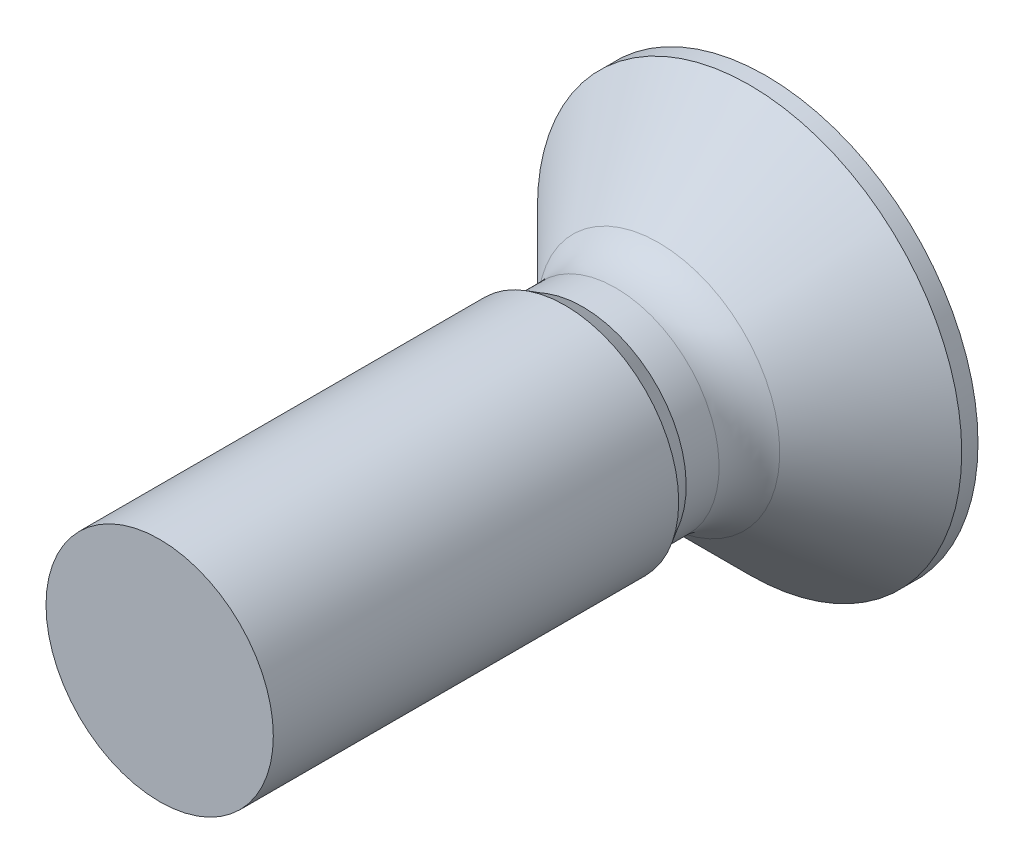
ISO-10303-21;
HEADER;
FILE_DESCRIPTION(('STEP AP214'),'2;1');
FILE_NAME('part.step','',(''),(''),'','','');
FILE_SCHEMA(('AUTOMOTIVE_DESIGN { 1 0 10303 214 1 1 1 1 }'));
ENDSEC;
DATA;
#1=APPLICATION_CONTEXT('core data for automotive mechanical design processes');
#2=APPLICATION_PROTOCOL_DEFINITION('international standard','automotive_design',2000,#1);
#3=PRODUCT_CONTEXT('',#1,'mechanical');
#4=PRODUCT('Part','Part','',(#3));
#5=PRODUCT_RELATED_PRODUCT_CATEGORY('part','',(#4));
#6=PRODUCT_DEFINITION_FORMATION('','',#4);
#7=PRODUCT_DEFINITION_CONTEXT('part definition',#1,'design');
#8=PRODUCT_DEFINITION('design','',#6,#7);
#9=PRODUCT_DEFINITION_SHAPE('','',#8);
#10=(LENGTH_UNIT() NAMED_UNIT(*) SI_UNIT(.MILLI.,.METRE.));
#11=(NAMED_UNIT(*) PLANE_ANGLE_UNIT() SI_UNIT($,.RADIAN.));
#12=(NAMED_UNIT(*) SI_UNIT($,.STERADIAN.) SOLID_ANGLE_UNIT());
#13=UNCERTAINTY_MEASURE_WITH_UNIT(LENGTH_MEASURE(1.E-05),#10,'distance_accuracy_value','');
#14=(GEOMETRIC_REPRESENTATION_CONTEXT(3) GLOBAL_UNCERTAINTY_ASSIGNED_CONTEXT((#13)) GLOBAL_UNIT_ASSIGNED_CONTEXT((#10,
#11,#12)) REPRESENTATION_CONTEXT('',''));
#15=CARTESIAN_POINT('',(0.,0.,0.));
#16=DIRECTION('',(0.,0.,1.));
#17=DIRECTION('',(1.,0.,0.));
#18=AXIS2_PLACEMENT_3D('',#15,#16,#17);
#19=CARTESIAN_POINT('',(0.,0.,-1.65));
#20=DIRECTION('',(0.,0.,-1.));
#21=DIRECTION('',(0.,1.,0.));
#22=AXIS2_PLACEMENT_3D('',#19,#20,#21);
#23=CONICAL_SURFACE('',#22,3.01468750000001,0.78539816339745);
#24=CARTESIAN_POINT('',(0.,0.,-0.234314575050763));
#25=DIRECTION('',(0.,0.,-1.));
#26=DIRECTION('',(0.,1.,0.));
#27=AXIS2_PLACEMENT_3D('',#24,#25,#26);
#28=CIRCLE('',#27,1.59900207505076);
#29=CARTESIAN_POINT('',(0.,1.59900207505076,-0.234314575050763));
#30=VERTEX_POINT('',#29);
#31=EDGE_CURVE('E40',#30,#30,#28,.T.);
#32=ORIENTED_EDGE('',*,*,#31,.T.);
#33=EDGE_LOOP('',(#32));
#34=FACE_BOUND('',#33,.T.);
#35=CARTESIAN_POINT('',(0.,0.,-1.4353125));
#36=DIRECTION('',(0.,0.,-1.));
#37=DIRECTION('',(0.,1.,0.));
#38=AXIS2_PLACEMENT_3D('',#35,#36,#37);
#39=CIRCLE('',#38,2.8);
#40=CARTESIAN_POINT('',(0.,2.8,-1.43531249999999));
#41=VERTEX_POINT('',#40);
#42=EDGE_CURVE('E227',#41,#41,#39,.F.);
#43=ORIENTED_EDGE('',*,*,#42,.T.);
#44=EDGE_LOOP('',(#43));
#45=FACE_BOUND('',#44,.T.);
#46=ADVANCED_FACE('F32',(#34,#45),#23,.T.);
#47=CARTESIAN_POINT('',(0.,0.,-1.65));
#48=DIRECTION('',(0.,0.,-1.));
#49=DIRECTION('',(0.,1.,0.));
#50=AXIS2_PLACEMENT_3D('',#47,#48,#49);
#51=CYLINDRICAL_SURFACE('',#50,1.3646875);
#52=CARTESIAN_POINT('',(0.,0.,0.331370849898476));
#53=DIRECTION('',(0.,0.,-1.));
#54=DIRECTION('',(0.,1.,0.));
#55=AXIS2_PLACEMENT_3D('',#52,#53,#54);
#56=CIRCLE('',#55,1.3646875);
#57=CARTESIAN_POINT('',(0.,1.3646875,0.331370849898476));
#58=VERTEX_POINT('',#57);
#59=EDGE_CURVE('E11',#58,#58,#56,.F.);
#60=ORIENTED_EDGE('',*,*,#59,.T.);
#61=EDGE_LOOP('',(#60));
#62=FACE_BOUND('',#61,.T.);
#63=CARTESIAN_POINT('',(0.,0.,0.765631875100837));
#64=DIRECTION('',(0.,0.,-1.));
#65=DIRECTION('',(0.,1.,0.));
#66=AXIS2_PLACEMENT_3D('',#63,#64,#65);
#67=CIRCLE('',#66,1.3646875);
#68=CARTESIAN_POINT('',(0.,1.3646875,0.765631875100837));
#69=VERTEX_POINT('',#68);
#70=EDGE_CURVE('E234',#69,#69,#67,.T.);
#71=ORIENTED_EDGE('',*,*,#70,.T.);
#72=EDGE_LOOP('',(#71));
#73=FACE_BOUND('',#72,.T.);
#74=ADVANCED_FACE('F258',(#62,#73),#51,.T.);
#75=CARTESIAN_POINT('',(0.,0.,0.765631875100837));
#76=DIRECTION('',(0.,0.,1.));
#77=DIRECTION('',(0.,-1.,0.));
#78=AXIS2_PLACEMENT_3D('',#75,#76,#77);
#79=CONICAL_SURFACE('',#78,1.3646875,0.523598775598299);
#80=CARTESIAN_POINT('',(0.,0.,1.));
#81=DIRECTION('',(0.,0.,-1.));
#82=DIRECTION('',(0.,1.,0.));
#83=AXIS2_PLACEMENT_3D('',#80,#81,#82);
#84=CIRCLE('',#83,1.5);
#85=CARTESIAN_POINT('',(0.,1.5,1.));
#86=VERTEX_POINT('',#85);
#87=EDGE_CURVE('E231',#86,#86,#84,.T.);
#88=ORIENTED_EDGE('',*,*,#87,.T.);
#89=EDGE_LOOP('',(#88));
#90=FACE_BOUND('',#89,.T.);
#91=ORIENTED_EDGE('',*,*,#70,.F.);
#92=EDGE_LOOP('',(#91));
#93=FACE_BOUND('',#92,.T.);
#94=ADVANCED_FACE('F262',(#90,#93),#79,.T.);
#95=CARTESIAN_POINT('',(0.,0.,-1.65));
#96=DIRECTION('',(0.,0.,-1.));
#97=DIRECTION('',(0.,1.,0.));
#98=AXIS2_PLACEMENT_3D('',#95,#96,#97);
#99=CYLINDRICAL_SURFACE('',#98,1.5);
#100=CARTESIAN_POINT('',(0.,0.,6.35));
#101=DIRECTION('',(0.,0.,-1.));
#102=DIRECTION('',(0.,1.,0.));
#103=AXIS2_PLACEMENT_3D('',#100,#101,#102);
#104=CIRCLE('',#103,1.5);
#105=CARTESIAN_POINT('',(0.,1.5,6.35));
#106=VERTEX_POINT('',#105);
#107=EDGE_CURVE('E228',#106,#106,#104,.T.);
#108=ORIENTED_EDGE('',*,*,#107,.T.);
#109=EDGE_LOOP('',(#108));
#110=FACE_BOUND('',#109,.T.);
#111=ORIENTED_EDGE('',*,*,#87,.F.);
#112=EDGE_LOOP('',(#111));
#113=FACE_BOUND('',#112,.T.);
#114=ADVANCED_FACE('F268',(#110,#113),#99,.T.);
#115=CARTESIAN_POINT('',(0.,1.5,6.35));
#116=DIRECTION('',(0.,0.,1.));
#117=DIRECTION('',(0.,-1.,0.));
#118=AXIS2_PLACEMENT_3D('',#115,#116,#117);
#119=PLANE('',#118);
#120=ORIENTED_EDGE('',*,*,#107,.F.);
#121=EDGE_LOOP('',(#120));
#122=FACE_BOUND('',#121,.T.);
#123=ADVANCED_FACE('F272',(#122),#119,.T.);
#124=CARTESIAN_POINT('',(0.,0.,6.35));
#125=DIRECTION('',(0.,0.,-1.));
#126=DIRECTION('',(0.,1.,0.));
#127=AXIS2_PLACEMENT_3D('',#124,#125,#126);
#128=CYLINDRICAL_SURFACE('',#127,2.8);
#129=ORIENTED_EDGE('',*,*,#42,.F.);
#130=EDGE_LOOP('',(#129));
#131=FACE_BOUND('',#130,.T.);
#132=CARTESIAN_POINT('',(0.,0.,-1.65));
#133=DIRECTION('',(0.,0.,-1.));
#134=DIRECTION('',(0.,1.,0.));
#135=AXIS2_PLACEMENT_3D('',#132,#133,#134);
#136=CIRCLE('',#135,2.8);
#137=CARTESIAN_POINT('',(0.,2.8,-1.65));
#138=VERTEX_POINT('',#137);
#139=EDGE_CURVE('E206',#138,#138,#136,.T.);
#140=ORIENTED_EDGE('',*,*,#139,.F.);
#141=EDGE_LOOP('',(#140));
#142=FACE_BOUND('',#141,.T.);
#143=ADVANCED_FACE('F254',(#131,#142),#128,.T.);
#144=CARTESIAN_POINT('',(0.,0.,-1.65));
#145=DIRECTION('',(0.,0.,-1.));
#146=DIRECTION('',(0.,1.,0.));
#147=AXIS2_PLACEMENT_3D('',#144,#145,#146);
#148=PLANE('',#147);
#149=CARTESIAN_POINT('',(-1.615,0.,-1.65));
#150=DIRECTION('',(0.,0.,1.));
#151=DIRECTION('',(0.,1.,0.));
#152=AXIS2_PLACEMENT_3D('',#149,#150,#151);
#153=CIRCLE('',#152,0.589999999999985);
#154=CARTESIAN_POINT('',(-1.30654024767802,-0.502943914564482,-1.65));
#155=VERTEX_POINT('',#154);
#156=CARTESIAN_POINT('',(-1.30654024767802,0.502943914564483,-1.65));
#157=VERTEX_POINT('',#156);
#158=EDGE_CURVE('E47',#155,#157,#153,.T.);
#159=ORIENTED_EDGE('',*,*,#158,.F.);
#160=CARTESIAN_POINT('',(0.,0.,-1.65));
#161=DIRECTION('',(0.,0.,-1.));
#162=DIRECTION('',(0.,1.,0.));
#163=AXIS2_PLACEMENT_3D('',#160,#161,#162);
#164=CIRCLE('',#163,1.39999999999999);
#165=CARTESIAN_POINT('',(-1.08883233053066,-0.880025088273717,-1.65));
#166=VERTEX_POINT('',#165);
#167=EDGE_CURVE('E170',#166,#155,#164,.T.);
#168=ORIENTED_EDGE('',*,*,#167,.F.);
#169=CARTESIAN_POINT('',(-0.807500000000005,-1.39863102711186,-1.65));
#170=DIRECTION('',(0.,0.,1.));
#171=DIRECTION('',(0.,1.,0.));
#172=AXIS2_PLACEMENT_3D('',#169,#170,#171);
#173=CIRCLE('',#172,0.590000000000003);
#174=CARTESIAN_POINT('',(-0.217707917147365,-1.38296900283823,-1.65));
#175=VERTEX_POINT('',#174);
#176=EDGE_CURVE('E167',#175,#166,#173,.T.);
#177=ORIENTED_EDGE('',*,*,#176,.F.);
#178=CARTESIAN_POINT('',(0.,0.,-1.65));
#179=DIRECTION('',(0.,0.,-1.));
#180=DIRECTION('',(0.,1.,0.));
#181=AXIS2_PLACEMENT_3D('',#178,#179,#180);
#182=CIRCLE('',#181,1.4);
#183=CARTESIAN_POINT('',(0.217707917147366,-1.38296900283823,-1.65));
#184=VERTEX_POINT('',#183);
#185=EDGE_CURVE('E164',#184,#175,#182,.T.);
#186=ORIENTED_EDGE('',*,*,#185,.F.);
#187=CARTESIAN_POINT('',(0.807500000000003,-1.39863102711187,-1.65));
#188=DIRECTION('',(0.,0.,1.));
#189=DIRECTION('',(0.,1.,0.));
#190=AXIS2_PLACEMENT_3D('',#187,#188,#189);
#191=CIRCLE('',#190,0.59);
#192=CARTESIAN_POINT('',(1.08883233053066,-0.880025088273724,-1.65));
#193=VERTEX_POINT('',#192);
#194=EDGE_CURVE('E161',#193,#184,#191,.T.);
#195=ORIENTED_EDGE('',*,*,#194,.F.);
#196=CARTESIAN_POINT('',(0.,0.,-1.65));
#197=DIRECTION('',(0.,0.,-1.));
#198=DIRECTION('',(0.,1.,0.));
#199=AXIS2_PLACEMENT_3D('',#196,#197,#198);
#200=CIRCLE('',#199,1.4);
#201=CARTESIAN_POINT('',(1.30654024767802,-0.502943914564499,-1.65));
#202=VERTEX_POINT('',#201);
#203=EDGE_CURVE('E158',#202,#193,#200,.T.);
#204=ORIENTED_EDGE('',*,*,#203,.F.);
#205=CARTESIAN_POINT('',(1.615,0.,-1.65));
#206=DIRECTION('',(0.,0.,1.));
#207=DIRECTION('',(0.,1.,0.));
#208=AXIS2_PLACEMENT_3D('',#205,#206,#207);
#209=CIRCLE('',#208,0.59);
#210=CARTESIAN_POINT('',(1.30654024767802,0.502943914564501,-1.65));
#211=VERTEX_POINT('',#210);
#212=EDGE_CURVE('E155',#211,#202,#209,.T.);
#213=ORIENTED_EDGE('',*,*,#212,.F.);
#214=CARTESIAN_POINT('',(0.,0.,-1.65));
#215=DIRECTION('',(0.,0.,-1.));
#216=DIRECTION('',(0.,1.,0.));
#217=AXIS2_PLACEMENT_3D('',#214,#215,#216);
#218=CIRCLE('',#217,1.4);
#219=CARTESIAN_POINT('',(1.08883233053065,0.88002508827374,-1.65));
#220=VERTEX_POINT('',#219);
#221=EDGE_CURVE('E152',#220,#211,#218,.T.);
#222=ORIENTED_EDGE('',*,*,#221,.F.);
#223=CARTESIAN_POINT('',(0.80749999999999,1.39863102711187,-1.65));
#224=DIRECTION('',(0.,0.,1.));
#225=DIRECTION('',(0.,1.,0.));
#226=AXIS2_PLACEMENT_3D('',#223,#224,#225);
#227=CIRCLE('',#226,0.589999999999992);
#228=CARTESIAN_POINT('',(0.217707917147361,1.38296900283823,-1.65));
#229=VERTEX_POINT('',#228);
#230=EDGE_CURVE('E146',#229,#220,#227,.T.);
#231=ORIENTED_EDGE('',*,*,#230,.F.);
#232=CARTESIAN_POINT('',(0.,0.,-1.65));
#233=DIRECTION('',(0.,0.,-1.));
#234=DIRECTION('',(0.,1.,0.));
#235=AXIS2_PLACEMENT_3D('',#232,#233,#234);
#236=CIRCLE('',#235,1.4);
#237=CARTESIAN_POINT('',(-0.217707917147361,1.38296900283823,-1.65));
#238=VERTEX_POINT('',#237);
#239=EDGE_CURVE('E144',#238,#229,#236,.T.);
#240=ORIENTED_EDGE('',*,*,#239,.F.);
#241=CARTESIAN_POINT('',(-0.807500000000012,1.39863102711186,-1.65));
#242=DIRECTION('',(0.,0.,1.));
#243=DIRECTION('',(0.,1.,0.));
#244=AXIS2_PLACEMENT_3D('',#241,#242,#243);
#245=CIRCLE('',#244,0.59);
#246=CARTESIAN_POINT('',(-1.08883233053066,0.880025088273715,-1.65));
#247=VERTEX_POINT('',#246);
#248=EDGE_CURVE('E126',#247,#238,#245,.T.);
#249=ORIENTED_EDGE('',*,*,#248,.F.);
#250=CARTESIAN_POINT('',(0.,0.,-1.65));
#251=DIRECTION('',(0.,0.,-1.));
#252=DIRECTION('',(0.,1.,0.));
#253=AXIS2_PLACEMENT_3D('',#250,#251,#252);
#254=CIRCLE('',#253,1.4);
#255=EDGE_CURVE('E137',#157,#247,#254,.T.);
#256=ORIENTED_EDGE('',*,*,#255,.F.);
#257=EDGE_LOOP('',(#159,#168,#177,#186,#195,#204,#213,#222,#231,#240,#249,#256));
#258=FACE_BOUND('',#257,.T.);
#259=ORIENTED_EDGE('',*,*,#139,.T.);
#260=EDGE_LOOP('',(#259));
#261=FACE_BOUND('',#260,.T.);
#262=ADVANCED_FACE('F34',(#258,#261),#148,.T.);
#263=CARTESIAN_POINT('',(0.,0.,0.331370849898476));
#264=DIRECTION('',(0.,0.,-1.));
#265=DIRECTION('',(0.,1.,0.));
#266=AXIS2_PLACEMENT_3D('',#263,#264,#265);
#267=TOROIDAL_SURFACE('',#266,2.1646875,0.8);
#268=ORIENTED_EDGE('',*,*,#59,.F.);
#269=EDGE_LOOP('',(#268));
#270=FACE_BOUND('',#269,.T.);
#271=ORIENTED_EDGE('',*,*,#31,.F.);
#272=EDGE_LOOP('',(#271));
#273=FACE_BOUND('',#272,.T.);
#274=ADVANCED_FACE('F243',(#270,#273),#267,.F.);
#275=CARTESIAN_POINT('',(-1.615,0.,-0.650000000000001));
#276=DIRECTION('',(0.,0.,-1.));
#277=DIRECTION('',(0.,1.,0.));
#278=AXIS2_PLACEMENT_3D('',#275,#276,#277);
#279=CYLINDRICAL_SURFACE('',#278,0.589999999999985);
#280=ORIENTED_EDGE('',*,*,#158,.T.);
#281=DIRECTION('',(0.,0.,-1.));
#282=VECTOR('',#281,1.);
#283=CARTESIAN_POINT('',(-1.30654024767802,0.502943914564483,-0.650000000000001));
#284=LINE('',#283,#282);
#285=CARTESIAN_POINT('',(-1.30654024767802,0.502943914564483,-0.650000000000001));
#286=VERTEX_POINT('',#285);
#287=EDGE_CURVE('E134',#286,#157,#284,.T.);
#288=ORIENTED_EDGE('',*,*,#287,.F.);
#289=CARTESIAN_POINT('',(-1.615,0.,-0.650000000000001));
#290=DIRECTION('',(0.,0.,1.));
#291=DIRECTION('',(0.,1.,0.));
#292=AXIS2_PLACEMENT_3D('',#289,#290,#291);
#293=CIRCLE('',#292,0.589999999999985);
#294=CARTESIAN_POINT('',(-1.30654024767802,-0.502943914564482,-0.650000000000001));
#295=VERTEX_POINT('',#294);
#296=EDGE_CURVE('E172',#295,#286,#293,.T.);
#297=ORIENTED_EDGE('',*,*,#296,.F.);
#298=DIRECTION('',(0.,0.,-1.));
#299=VECTOR('',#298,1.);
#300=CARTESIAN_POINT('',(-1.30654024767802,-0.502943914564482,-0.650000000000001));
#301=LINE('',#300,#299);
#302=EDGE_CURVE('E54',#295,#155,#301,.T.);
#303=ORIENTED_EDGE('',*,*,#302,.T.);
#304=EDGE_LOOP('',(#280,#288,#297,#303));
#305=FACE_BOUND('',#304,.T.);
#306=ADVANCED_FACE('F245',(#305),#279,.T.);
#307=CARTESIAN_POINT('',(0.,0.,-0.650000000000001));
#308=DIRECTION('',(0.,0.,-1.));
#309=DIRECTION('',(0.,1.,0.));
#310=AXIS2_PLACEMENT_3D('',#307,#308,#309);
#311=CYLINDRICAL_SURFACE('',#310,1.39999999999999);
#312=ORIENTED_EDGE('',*,*,#167,.T.);
#313=ORIENTED_EDGE('',*,*,#302,.F.);
#314=CARTESIAN_POINT('',(0.,0.,-0.650000000000001));
#315=DIRECTION('',(0.,0.,-1.));
#316=DIRECTION('',(0.,1.,0.));
#317=AXIS2_PLACEMENT_3D('',#314,#315,#316);
#318=CIRCLE('',#317,1.39999999999999);
#319=CARTESIAN_POINT('',(-1.08883233053066,-0.880025088273717,-0.650000000000001));
#320=VERTEX_POINT('',#319);
#321=EDGE_CURVE('E202',#320,#295,#318,.T.);
#322=ORIENTED_EDGE('',*,*,#321,.F.);
#323=DIRECTION('',(0.,0.,-1.));
#324=VECTOR('',#323,1.);
#325=CARTESIAN_POINT('',(-1.08883233053066,-0.880025088273717,-0.650000000000001));
#326=LINE('',#325,#324);
#327=EDGE_CURVE('E207',#320,#166,#326,.T.);
#328=ORIENTED_EDGE('',*,*,#327,.T.);
#329=EDGE_LOOP('',(#312,#313,#322,#328));
#330=FACE_BOUND('',#329,.T.);
#331=ADVANCED_FACE('F252',(#330),#311,.F.);
#332=CARTESIAN_POINT('',(-0.807500000000005,-1.39863102711187,-0.650000000000001));
#333=DIRECTION('',(0.,0.,-1.));
#334=DIRECTION('',(0.,1.,0.));
#335=AXIS2_PLACEMENT_3D('',#332,#333,#334);
#336=CYLINDRICAL_SURFACE('',#335,0.590000000000003);
#337=ORIENTED_EDGE('',*,*,#176,.T.);
#338=ORIENTED_EDGE('',*,*,#327,.F.);
#339=CARTESIAN_POINT('',(-0.807500000000005,-1.39863102711187,-0.650000000000001));
#340=DIRECTION('',(0.,0.,1.));
#341=DIRECTION('',(0.,1.,0.));
#342=AXIS2_PLACEMENT_3D('',#339,#340,#341);
#343=CIRCLE('',#342,0.590000000000003);
#344=CARTESIAN_POINT('',(-0.217707917147365,-1.38296900283823,-0.650000000000001));
#345=VERTEX_POINT('',#344);
#346=EDGE_CURVE('E199',#345,#320,#343,.T.);
#347=ORIENTED_EDGE('',*,*,#346,.F.);
#348=DIRECTION('',(0.,0.,-1.));
#349=VECTOR('',#348,1.);
#350=CARTESIAN_POINT('',(-0.217707917147365,-1.38296900283823,-0.650000000000001));
#351=LINE('',#350,#349);
#352=EDGE_CURVE('E209',#345,#175,#351,.T.);
#353=ORIENTED_EDGE('',*,*,#352,.T.);
#354=EDGE_LOOP('',(#337,#338,#347,#353));
#355=FACE_BOUND('',#354,.T.);
#356=ADVANCED_FACE('F308',(#355),#336,.T.);
#357=CARTESIAN_POINT('',(0.,0.,-0.650000000000001));
#358=DIRECTION('',(0.,0.,-1.));
#359=DIRECTION('',(0.,1.,0.));
#360=AXIS2_PLACEMENT_3D('',#357,#358,#359);
#361=CYLINDRICAL_SURFACE('',#360,1.4);
#362=ORIENTED_EDGE('',*,*,#185,.T.);
#363=ORIENTED_EDGE('',*,*,#352,.F.);
#364=CARTESIAN_POINT('',(0.,0.,-0.650000000000001));
#365=DIRECTION('',(0.,0.,-1.));
#366=DIRECTION('',(0.,1.,0.));
#367=AXIS2_PLACEMENT_3D('',#364,#365,#366);
#368=CIRCLE('',#367,1.4);
#369=CARTESIAN_POINT('',(0.217707917147366,-1.38296900283823,-0.650000000000001));
#370=VERTEX_POINT('',#369);
#371=EDGE_CURVE('E196',#370,#345,#368,.T.);
#372=ORIENTED_EDGE('',*,*,#371,.F.);
#373=DIRECTION('',(0.,0.,-1.));
#374=VECTOR('',#373,1.);
#375=CARTESIAN_POINT('',(0.217707917147366,-1.38296900283823,-0.650000000000001));
#376=LINE('',#375,#374);
#377=EDGE_CURVE('E211',#370,#184,#376,.T.);
#378=ORIENTED_EDGE('',*,*,#377,.T.);
#379=EDGE_LOOP('',(#362,#363,#372,#378));
#380=FACE_BOUND('',#379,.T.);
#381=ADVANCED_FACE('F317',(#380),#361,.F.);
#382=CARTESIAN_POINT('',(0.807500000000003,-1.39863102711187,-0.650000000000001));
#383=DIRECTION('',(0.,0.,-1.));
#384=DIRECTION('',(0.,1.,0.));
#385=AXIS2_PLACEMENT_3D('',#382,#383,#384);
#386=CYLINDRICAL_SURFACE('',#385,0.59);
#387=ORIENTED_EDGE('',*,*,#194,.T.);
#388=ORIENTED_EDGE('',*,*,#377,.F.);
#389=CARTESIAN_POINT('',(0.807500000000003,-1.39863102711187,-0.650000000000001));
#390=DIRECTION('',(0.,0.,1.));
#391=DIRECTION('',(0.,1.,0.));
#392=AXIS2_PLACEMENT_3D('',#389,#390,#391);
#393=CIRCLE('',#392,0.59);
#394=CARTESIAN_POINT('',(1.08883233053066,-0.880025088273724,-0.650000000000001));
#395=VERTEX_POINT('',#394);
#396=EDGE_CURVE('E193',#395,#370,#393,.T.);
#397=ORIENTED_EDGE('',*,*,#396,.F.);
#398=DIRECTION('',(0.,0.,-1.));
#399=VECTOR('',#398,1.);
#400=CARTESIAN_POINT('',(1.08883233053066,-0.880025088273724,-0.650000000000001));
#401=LINE('',#400,#399);
#402=EDGE_CURVE('E213',#395,#193,#401,.T.);
#403=ORIENTED_EDGE('',*,*,#402,.T.);
#404=EDGE_LOOP('',(#387,#388,#397,#403));
#405=FACE_BOUND('',#404,.T.);
#406=ADVANCED_FACE('F327',(#405),#386,.T.);
#407=CARTESIAN_POINT('',(0.,0.,-0.650000000000001));
#408=DIRECTION('',(0.,0.,-1.));
#409=DIRECTION('',(0.,1.,0.));
#410=AXIS2_PLACEMENT_3D('',#407,#408,#409);
#411=CYLINDRICAL_SURFACE('',#410,1.4);
#412=ORIENTED_EDGE('',*,*,#203,.T.);
#413=ORIENTED_EDGE('',*,*,#402,.F.);
#414=CARTESIAN_POINT('',(0.,0.,-0.650000000000001));
#415=DIRECTION('',(0.,0.,-1.));
#416=DIRECTION('',(0.,1.,0.));
#417=AXIS2_PLACEMENT_3D('',#414,#415,#416);
#418=CIRCLE('',#417,1.4);
#419=CARTESIAN_POINT('',(1.30654024767802,-0.502943914564499,-0.650000000000001));
#420=VERTEX_POINT('',#419);
#421=EDGE_CURVE('E190',#420,#395,#418,.T.);
#422=ORIENTED_EDGE('',*,*,#421,.F.);
#423=DIRECTION('',(0.,0.,-1.));
#424=VECTOR('',#423,1.);
#425=CARTESIAN_POINT('',(1.30654024767802,-0.502943914564499,-0.650000000000001));
#426=LINE('',#425,#424);
#427=EDGE_CURVE('E215',#420,#202,#426,.T.);
#428=ORIENTED_EDGE('',*,*,#427,.T.);
#429=EDGE_LOOP('',(#412,#413,#422,#428));
#430=FACE_BOUND('',#429,.T.);
#431=ADVANCED_FACE('F337',(#430),#411,.F.);
#432=CARTESIAN_POINT('',(1.615,0.,-0.650000000000001));
#433=DIRECTION('',(0.,0.,-1.));
#434=DIRECTION('',(0.,1.,0.));
#435=AXIS2_PLACEMENT_3D('',#432,#433,#434);
#436=CYLINDRICAL_SURFACE('',#435,0.59);
#437=ORIENTED_EDGE('',*,*,#212,.T.);
#438=ORIENTED_EDGE('',*,*,#427,.F.);
#439=CARTESIAN_POINT('',(1.615,0.,-0.650000000000001));
#440=DIRECTION('',(0.,0.,1.));
#441=DIRECTION('',(0.,1.,0.));
#442=AXIS2_PLACEMENT_3D('',#439,#440,#441);
#443=CIRCLE('',#442,0.59);
#444=CARTESIAN_POINT('',(1.30654024767802,0.502943914564501,-0.650000000000001));
#445=VERTEX_POINT('',#444);
#446=EDGE_CURVE('E187',#445,#420,#443,.T.);
#447=ORIENTED_EDGE('',*,*,#446,.F.);
#448=DIRECTION('',(0.,0.,-1.));
#449=VECTOR('',#448,1.);
#450=CARTESIAN_POINT('',(1.30654024767802,0.502943914564501,-0.650000000000001));
#451=LINE('',#450,#449);
#452=EDGE_CURVE('E217',#445,#211,#451,.T.);
#453=ORIENTED_EDGE('',*,*,#452,.T.);
#454=EDGE_LOOP('',(#437,#438,#447,#453));
#455=FACE_BOUND('',#454,.T.);
#456=ADVANCED_FACE('F347',(#455),#436,.T.);
#457=CARTESIAN_POINT('',(0.,0.,-0.650000000000001));
#458=DIRECTION('',(0.,0.,-1.));
#459=DIRECTION('',(0.,1.,0.));
#460=AXIS2_PLACEMENT_3D('',#457,#458,#459);
#461=CYLINDRICAL_SURFACE('',#460,1.4);
#462=ORIENTED_EDGE('',*,*,#221,.T.);
#463=ORIENTED_EDGE('',*,*,#452,.F.);
#464=CARTESIAN_POINT('',(0.,0.,-0.650000000000001));
#465=DIRECTION('',(0.,0.,-1.));
#466=DIRECTION('',(0.,1.,0.));
#467=AXIS2_PLACEMENT_3D('',#464,#465,#466);
#468=CIRCLE('',#467,1.4);
#469=CARTESIAN_POINT('',(1.08883233053065,0.88002508827374,-0.650000000000001));
#470=VERTEX_POINT('',#469);
#471=EDGE_CURVE('E184',#470,#445,#468,.T.);
#472=ORIENTED_EDGE('',*,*,#471,.F.);
#473=DIRECTION('',(0.,0.,-1.));
#474=VECTOR('',#473,1.);
#475=CARTESIAN_POINT('',(1.08883233053065,0.88002508827374,-0.650000000000001));
#476=LINE('',#475,#474);
#477=EDGE_CURVE('E219',#470,#220,#476,.T.);
#478=ORIENTED_EDGE('',*,*,#477,.T.);
#479=EDGE_LOOP('',(#462,#463,#472,#478));
#480=FACE_BOUND('',#479,.T.);
#481=ADVANCED_FACE('F357',(#480),#461,.F.);
#482=CARTESIAN_POINT('',(0.80749999999999,1.39863102711187,-0.65));
#483=DIRECTION('',(0.,0.,-1.));
#484=DIRECTION('',(0.,1.,0.));
#485=AXIS2_PLACEMENT_3D('',#482,#483,#484);
#486=CYLINDRICAL_SURFACE('',#485,0.589999999999992);
#487=ORIENTED_EDGE('',*,*,#230,.T.);
#488=ORIENTED_EDGE('',*,*,#477,.F.);
#489=CARTESIAN_POINT('',(0.80749999999999,1.39863102711187,-0.65));
#490=DIRECTION('',(0.,0.,1.));
#491=DIRECTION('',(0.,1.,0.));
#492=AXIS2_PLACEMENT_3D('',#489,#490,#491);
#493=CIRCLE('',#492,0.589999999999992);
#494=CARTESIAN_POINT('',(0.217707917147361,1.38296900283823,-0.65));
#495=VERTEX_POINT('',#494);
#496=EDGE_CURVE('E181',#495,#470,#493,.T.);
#497=ORIENTED_EDGE('',*,*,#496,.F.);
#498=DIRECTION('',(0.,0.,-1.));
#499=VECTOR('',#498,1.);
#500=CARTESIAN_POINT('',(0.217707917147361,1.38296900283823,-0.65));
#501=LINE('',#500,#499);
#502=EDGE_CURVE('E221',#495,#229,#501,.T.);
#503=ORIENTED_EDGE('',*,*,#502,.T.);
#504=EDGE_LOOP('',(#487,#488,#497,#503));
#505=FACE_BOUND('',#504,.T.);
#506=ADVANCED_FACE('F367',(#505),#486,.T.);
#507=CARTESIAN_POINT('',(0.,0.,-0.650000000000001));
#508=DIRECTION('',(0.,0.,-1.));
#509=DIRECTION('',(0.,1.,0.));
#510=AXIS2_PLACEMENT_3D('',#507,#508,#509);
#511=CYLINDRICAL_SURFACE('',#510,1.4);
#512=ORIENTED_EDGE('',*,*,#239,.T.);
#513=ORIENTED_EDGE('',*,*,#502,.F.);
#514=CARTESIAN_POINT('',(0.,0.,-0.650000000000001));
#515=DIRECTION('',(0.,0.,-1.));
#516=DIRECTION('',(0.,1.,0.));
#517=AXIS2_PLACEMENT_3D('',#514,#515,#516);
#518=CIRCLE('',#517,1.4);
#519=CARTESIAN_POINT('',(-0.217707917147361,1.38296900283823,-0.65));
#520=VERTEX_POINT('',#519);
#521=EDGE_CURVE('E178',#520,#495,#518,.T.);
#522=ORIENTED_EDGE('',*,*,#521,.F.);
#523=DIRECTION('',(0.,0.,-1.));
#524=VECTOR('',#523,1.);
#525=CARTESIAN_POINT('',(-0.217707917147361,1.38296900283823,-0.65));
#526=LINE('',#525,#524);
#527=EDGE_CURVE('E133',#520,#238,#526,.T.);
#528=ORIENTED_EDGE('',*,*,#527,.T.);
#529=EDGE_LOOP('',(#512,#513,#522,#528));
#530=FACE_BOUND('',#529,.T.);
#531=ADVANCED_FACE('F377',(#530),#511,.F.);
#532=CARTESIAN_POINT('',(-0.807500000000012,1.39863102711186,-0.65));
#533=DIRECTION('',(0.,0.,-1.));
#534=DIRECTION('',(0.,1.,0.));
#535=AXIS2_PLACEMENT_3D('',#532,#533,#534);
#536=CYLINDRICAL_SURFACE('',#535,0.59);
#537=ORIENTED_EDGE('',*,*,#248,.T.);
#538=ORIENTED_EDGE('',*,*,#527,.F.);
#539=CARTESIAN_POINT('',(-0.807500000000012,1.39863102711186,-0.65));
#540=DIRECTION('',(0.,0.,1.));
#541=DIRECTION('',(0.,1.,0.));
#542=AXIS2_PLACEMENT_3D('',#539,#540,#541);
#543=CIRCLE('',#542,0.59);
#544=CARTESIAN_POINT('',(-1.08883233053066,0.880025088273715,-0.65));
#545=VERTEX_POINT('',#544);
#546=EDGE_CURVE('E129',#545,#520,#543,.T.);
#547=ORIENTED_EDGE('',*,*,#546,.F.);
#548=DIRECTION('',(0.,0.,-1.));
#549=VECTOR('',#548,1.);
#550=CARTESIAN_POINT('',(-1.08883233053066,0.880025088273715,-0.65));
#551=LINE('',#550,#549);
#552=EDGE_CURVE('E122',#545,#247,#551,.T.);
#553=ORIENTED_EDGE('',*,*,#552,.T.);
#554=EDGE_LOOP('',(#537,#538,#547,#553));
#555=FACE_BOUND('',#554,.T.);
#556=ADVANCED_FACE('F124',(#555),#536,.T.);
#557=CARTESIAN_POINT('',(0.,0.,-0.650000000000001));
#558=DIRECTION('',(0.,0.,-1.));
#559=DIRECTION('',(0.,1.,0.));
#560=AXIS2_PLACEMENT_3D('',#557,#558,#559);
#561=CYLINDRICAL_SURFACE('',#560,1.4);
#562=ORIENTED_EDGE('',*,*,#255,.T.);
#563=ORIENTED_EDGE('',*,*,#552,.F.);
#564=CARTESIAN_POINT('',(0.,0.,-0.650000000000001));
#565=DIRECTION('',(0.,0.,-1.));
#566=DIRECTION('',(0.,1.,0.));
#567=AXIS2_PLACEMENT_3D('',#564,#565,#566);
#568=CIRCLE('',#567,1.4);
#569=EDGE_CURVE('E175',#286,#545,#568,.T.);
#570=ORIENTED_EDGE('',*,*,#569,.F.);
#571=ORIENTED_EDGE('',*,*,#287,.T.);
#572=EDGE_LOOP('',(#562,#563,#570,#571));
#573=FACE_BOUND('',#572,.T.);
#574=ADVANCED_FACE('F138',(#573),#561,.F.);
#575=CARTESIAN_POINT('',(-0.8075,0.,-0.650000000000001));
#576=DIRECTION('',(0.,0.,-1.));
#577=DIRECTION('',(0.,1.,0.));
#578=AXIS2_PLACEMENT_3D('',#575,#576,#577);
#579=PLANE('',#578);
#580=ORIENTED_EDGE('',*,*,#296,.T.);
#581=ORIENTED_EDGE('',*,*,#569,.T.);
#582=ORIENTED_EDGE('',*,*,#546,.T.);
#583=ORIENTED_EDGE('',*,*,#521,.T.);
#584=ORIENTED_EDGE('',*,*,#496,.T.);
#585=ORIENTED_EDGE('',*,*,#471,.T.);
#586=ORIENTED_EDGE('',*,*,#446,.T.);
#587=ORIENTED_EDGE('',*,*,#421,.T.);
#588=ORIENTED_EDGE('',*,*,#396,.T.);
#589=ORIENTED_EDGE('',*,*,#371,.T.);
#590=ORIENTED_EDGE('',*,*,#346,.T.);
#591=ORIENTED_EDGE('',*,*,#321,.T.);
#592=EDGE_LOOP('',(#580,#581,#582,#583,#584,#585,#586,#587,#588,#589,#590,#591));
#593=FACE_BOUND('',#592,.T.);
#594=ADVANCED_FACE('F404',(#593),#579,.T.);
#595=CLOSED_SHELL('',(#46,#74,#94,#114,#123,#143,#262,#274,#306,#331,#356,#381,#406,#431,#456,
#481,#506,#531,#556,#574,#594));
#596=MANIFOLD_SOLID_BREP('B2',#595);
#597=ADVANCED_BREP_SHAPE_REPRESENTATION('',(#18,#596),#14);
#598=SHAPE_DEFINITION_REPRESENTATION(#9,#597);
ENDSEC;
END-ISO-10303-21;
